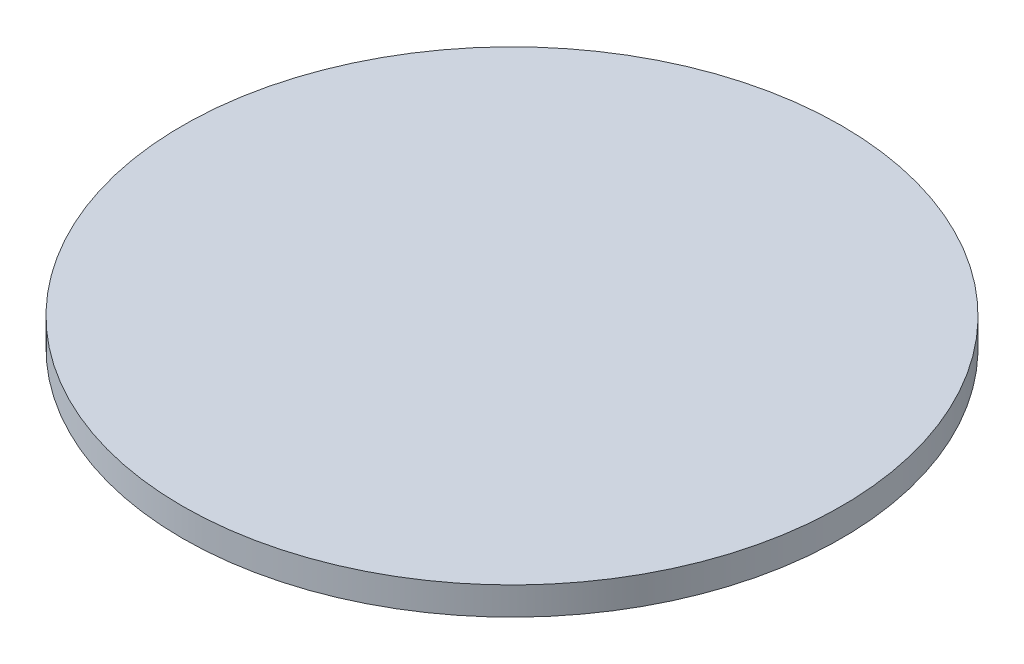
ISO-10303-21;
HEADER;
FILE_DESCRIPTION(('STEP AP214'),'2;1');
FILE_NAME('part.step','',(''),(''),'','','');
FILE_SCHEMA(('AUTOMOTIVE_DESIGN { 1 0 10303 214 1 1 1 1 }'));
ENDSEC;
DATA;
#1=APPLICATION_CONTEXT('core data for automotive mechanical design processes');
#2=APPLICATION_PROTOCOL_DEFINITION('international standard','automotive_design',2000,#1);
#3=PRODUCT_CONTEXT('',#1,'mechanical');
#4=PRODUCT('Part','Part','',(#3));
#5=PRODUCT_RELATED_PRODUCT_CATEGORY('part','',(#4));
#6=PRODUCT_DEFINITION_FORMATION('','',#4);
#7=PRODUCT_DEFINITION_CONTEXT('part definition',#1,'design');
#8=PRODUCT_DEFINITION('design','',#6,#7);
#9=PRODUCT_DEFINITION_SHAPE('','',#8);
#10=(LENGTH_UNIT() NAMED_UNIT(*) SI_UNIT(.MILLI.,.METRE.));
#11=(NAMED_UNIT(*) PLANE_ANGLE_UNIT() SI_UNIT($,.RADIAN.));
#12=(NAMED_UNIT(*) SI_UNIT($,.STERADIAN.) SOLID_ANGLE_UNIT());
#13=UNCERTAINTY_MEASURE_WITH_UNIT(LENGTH_MEASURE(1.E-05),#10,'distance_accuracy_value','');
#14=(GEOMETRIC_REPRESENTATION_CONTEXT(3) GLOBAL_UNCERTAINTY_ASSIGNED_CONTEXT((#13)) GLOBAL_UNIT_ASSIGNED_CONTEXT((#10,
#11,#12)) REPRESENTATION_CONTEXT('',''));
#15=CARTESIAN_POINT('',(0.,0.,0.));
#16=DIRECTION('',(0.,0.,1.));
#17=DIRECTION('',(1.,0.,0.));
#18=AXIS2_PLACEMENT_3D('',#15,#16,#17);
#19=CARTESIAN_POINT('',(0.,0.254,0.));
#20=DIRECTION('',(0.,-1.,0.));
#21=DIRECTION('',(0.,0.,-1.));
#22=AXIS2_PLACEMENT_3D('',#19,#20,#21);
#23=CYLINDRICAL_SURFACE('',#22,6.);
#24=CARTESIAN_POINT('',(0.,0.254,0.));
#25=DIRECTION('',(0.,1.,0.));
#26=DIRECTION('',(0.,0.,1.));
#27=AXIS2_PLACEMENT_3D('',#24,#25,#26);
#28=CIRCLE('',#27,6.);
#29=CARTESIAN_POINT('',(0.,0.254,6.));
#30=VERTEX_POINT('',#29);
#31=EDGE_CURVE('E10',#30,#30,#28,.T.);
#32=ORIENTED_EDGE('',*,*,#31,.F.);
#33=EDGE_LOOP('',(#32));
#34=FACE_BOUND('',#33,.T.);
#35=CARTESIAN_POINT('',(0.,-0.254,0.));
#36=DIRECTION('',(0.,1.,0.));
#37=DIRECTION('',(0.,0.,1.));
#38=AXIS2_PLACEMENT_3D('',#35,#36,#37);
#39=CIRCLE('',#38,6.);
#40=CARTESIAN_POINT('',(0.,-0.254,6.));
#41=VERTEX_POINT('',#40);
#42=EDGE_CURVE('E33',#41,#41,#39,.T.);
#43=ORIENTED_EDGE('',*,*,#42,.T.);
#44=EDGE_LOOP('',(#43));
#45=FACE_BOUND('',#44,.T.);
#46=ADVANCED_FACE('F30',(#34,#45),#23,.T.);
#47=CARTESIAN_POINT('',(0.,0.254,0.));
#48=DIRECTION('',(0.,1.,0.));
#49=DIRECTION('',(0.,0.,1.));
#50=AXIS2_PLACEMENT_3D('',#47,#48,#49);
#51=PLANE('',#50);
#52=ORIENTED_EDGE('',*,*,#31,.T.);
#53=EDGE_LOOP('',(#52));
#54=FACE_BOUND('',#53,.T.);
#55=ADVANCED_FACE('F45',(#54),#51,.T.);
#56=CARTESIAN_POINT('',(0.,-0.254,0.));
#57=DIRECTION('',(0.,1.,0.));
#58=DIRECTION('',(0.,0.,1.));
#59=AXIS2_PLACEMENT_3D('',#56,#57,#58);
#60=PLANE('',#59);
#61=ORIENTED_EDGE('',*,*,#42,.F.);
#62=EDGE_LOOP('',(#61));
#63=FACE_BOUND('',#62,.T.);
#64=ADVANCED_FACE('F43',(#63),#60,.F.);
#65=CLOSED_SHELL('',(#46,#55,#64));
#66=MANIFOLD_SOLID_BREP('B2',#65);
#67=ADVANCED_BREP_SHAPE_REPRESENTATION('',(#18,#66),#14);
#68=SHAPE_DEFINITION_REPRESENTATION(#9,#67);
ENDSEC;
END-ISO-10303-21;
